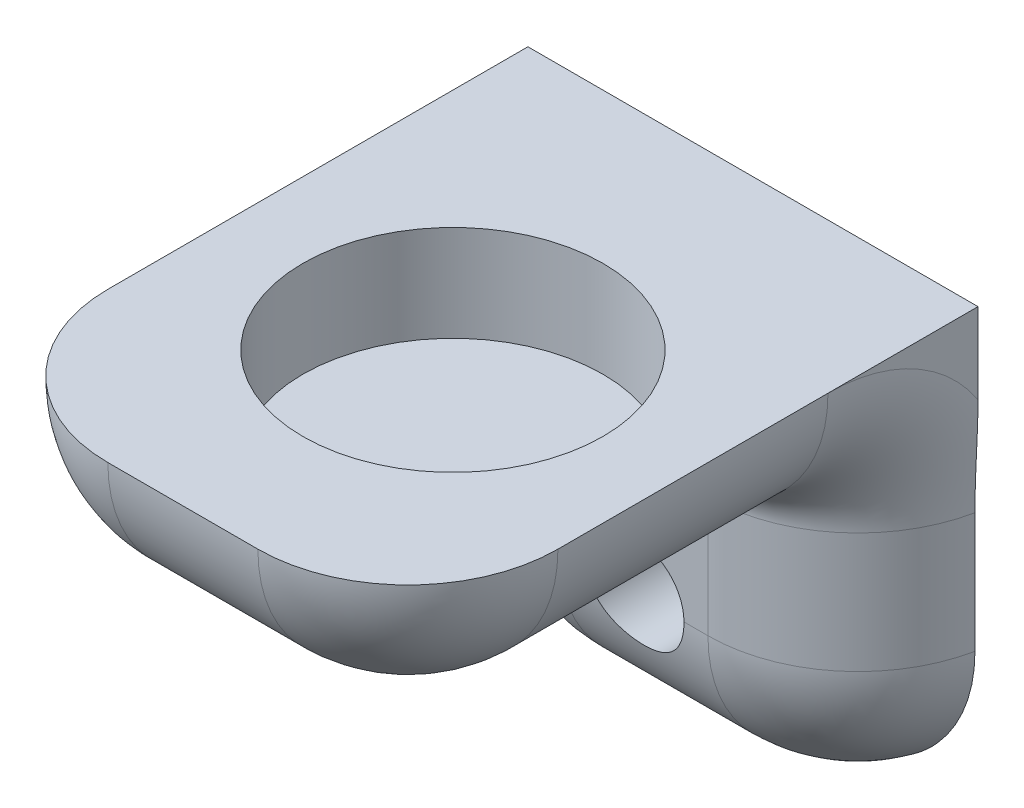
ISO-10303-21;
HEADER;
FILE_DESCRIPTION(('STEP AP214'),'2;1');
FILE_NAME('part.step','',(''),(''),'','','');
FILE_SCHEMA(('AUTOMOTIVE_DESIGN { 1 0 10303 214 1 1 1 1 }'));
ENDSEC;
DATA;
#1=APPLICATION_CONTEXT('core data for automotive mechanical design processes');
#2=APPLICATION_PROTOCOL_DEFINITION('international standard','automotive_design',2000,#1);
#3=PRODUCT_CONTEXT('',#1,'mechanical');
#4=PRODUCT('Part','Part','',(#3));
#5=PRODUCT_RELATED_PRODUCT_CATEGORY('part','',(#4));
#6=PRODUCT_DEFINITION_FORMATION('','',#4);
#7=PRODUCT_DEFINITION_CONTEXT('part definition',#1,'design');
#8=PRODUCT_DEFINITION('design','',#6,#7);
#9=PRODUCT_DEFINITION_SHAPE('','',#8);
#10=(LENGTH_UNIT() NAMED_UNIT(*) SI_UNIT(.MILLI.,.METRE.));
#11=(NAMED_UNIT(*) PLANE_ANGLE_UNIT() SI_UNIT($,.RADIAN.));
#12=(NAMED_UNIT(*) SI_UNIT($,.STERADIAN.) SOLID_ANGLE_UNIT());
#13=UNCERTAINTY_MEASURE_WITH_UNIT(LENGTH_MEASURE(1.E-05),#10,'distance_accuracy_value','');
#14=(GEOMETRIC_REPRESENTATION_CONTEXT(3) GLOBAL_UNCERTAINTY_ASSIGNED_CONTEXT((#13)) GLOBAL_UNIT_ASSIGNED_CONTEXT((#10,
#11,#12)) REPRESENTATION_CONTEXT('',''));
#15=CARTESIAN_POINT('',(0.,0.,0.));
#16=DIRECTION('',(0.,0.,1.));
#17=DIRECTION('',(1.,0.,0.));
#18=AXIS2_PLACEMENT_3D('',#15,#16,#17);
#19=CARTESIAN_POINT('',(0.,15.,0.));
#20=DIRECTION('',(0.,0.,-1.));
#21=DIRECTION('',(-1.,0.,0.));
#22=AXIS2_PLACEMENT_3D('',#19,#20,#21);
#23=PLANE('',#22);
#24=DIRECTION('',(0.,-1.,0.));
#25=VECTOR('',#24,1.);
#26=CARTESIAN_POINT('',(5.,15.,0.));
#27=LINE('',#26,#25);
#28=CARTESIAN_POINT('',(5.,9.,0.));
#29=VERTEX_POINT('',#28);
#30=CARTESIAN_POINT('',(5.,5.,0.));
#31=VERTEX_POINT('',#30);
#32=EDGE_CURVE('E170',#29,#31,#27,.T.);
#33=ORIENTED_EDGE('',*,*,#32,.T.);
#34=DIRECTION('',(1.,0.,0.));
#35=VECTOR('',#34,1.);
#36=CARTESIAN_POINT('',(10.,5.,0.));
#37=LINE('',#36,#35);
#38=CARTESIAN_POINT('',(6.00102051443364,5.,0.));
#39=VERTEX_POINT('',#38);
#40=EDGE_CURVE('E49',#31,#39,#37,.T.);
#41=ORIENTED_EDGE('',*,*,#40,.T.);
#42=CARTESIAN_POINT('',(7.60102051443364,5.,0.));
#43=DIRECTION('',(0.,0.,1.));
#44=DIRECTION('',(1.,0.,0.));
#45=AXIS2_PLACEMENT_3D('',#42,#43,#44);
#46=CIRCLE('',#45,1.6);
#47=CARTESIAN_POINT('',(9.20102051443365,5.,0.));
#48=VERTEX_POINT('',#47);
#49=EDGE_CURVE('E359',#48,#39,#46,.T.);
#50=ORIENTED_EDGE('',*,*,#49,.F.);
#51=DIRECTION('',(1.,0.,0.));
#52=VECTOR('',#51,1.);
#53=CARTESIAN_POINT('',(10.,5.,0.));
#54=LINE('',#53,#52);
#55=CARTESIAN_POINT('',(10.,5.,0.));
#56=VERTEX_POINT('',#55);
#57=EDGE_CURVE('E320',#48,#56,#54,.T.);
#58=ORIENTED_EDGE('',*,*,#57,.T.);
#59=DIRECTION('',(0.,-1.,0.));
#60=VECTOR('',#59,1.);
#61=CARTESIAN_POINT('',(10.,15.,0.));
#62=LINE('',#61,#60);
#63=CARTESIAN_POINT('',(10.,9.,0.));
#64=VERTEX_POINT('',#63);
#65=EDGE_CURVE('E168',#56,#64,#62,.F.);
#66=ORIENTED_EDGE('',*,*,#65,.T.);
#67=DIRECTION('',(1.,0.,0.));
#68=VECTOR('',#67,1.);
#69=CARTESIAN_POINT('',(0.,9.,0.));
#70=LINE('',#69,#68);
#71=EDGE_CURVE('E165',#64,#29,#70,.F.);
#72=ORIENTED_EDGE('',*,*,#71,.T.);
#73=EDGE_LOOP('',(#33,#41,#50,#58,#66,#72));
#74=FACE_BOUND('',#73,.T.);
#75=ADVANCED_FACE('F40',(#74),#23,.F.);
#76=CARTESIAN_POINT('',(0.,15.,0.));
#77=DIRECTION('',(1.,0.,0.));
#78=DIRECTION('',(0.,0.,-1.));
#79=AXIS2_PLACEMENT_3D('',#76,#77,#78);
#80=PLANE('',#79);
#81=DIRECTION('',(0.,-1.,0.));
#82=VECTOR('',#81,1.);
#83=CARTESIAN_POINT('',(0.,15.,-4.));
#84=LINE('',#83,#82);
#85=CARTESIAN_POINT('',(0.,15.,-4.));
#86=VERTEX_POINT('',#85);
#87=CARTESIAN_POINT('',(0.,12.3166247903554,-4.));
#88=VERTEX_POINT('',#87);
#89=EDGE_CURVE('E154',#86,#88,#84,.T.);
#90=ORIENTED_EDGE('',*,*,#89,.T.);
#91=CARTESIAN_POINT('',(0.,9.,1.));
#92=DIRECTION('',(1.,0.,0.));
#93=DIRECTION('',(0.,0.,-1.));
#94=AXIS2_PLACEMENT_3D('',#91,#92,#93);
#95=CIRCLE('',#94,6.);
#96=CARTESIAN_POINT('',(0.,15.,1.));
#97=VERTEX_POINT('',#96);
#98=EDGE_CURVE('E280',#88,#97,#95,.T.);
#99=ORIENTED_EDGE('',*,*,#98,.T.);
#100=DIRECTION('',(0.,0.,1.));
#101=VECTOR('',#100,1.);
#102=CARTESIAN_POINT('',(0.,15.,0.));
#103=LINE('',#102,#101);
#104=EDGE_CURVE('E145',#86,#97,#103,.T.);
#105=ORIENTED_EDGE('',*,*,#104,.F.);
#106=EDGE_LOOP('',(#90,#99,#105));
#107=FACE_BOUND('',#106,.T.);
#108=ADVANCED_FACE('F236',(#107),#80,.F.);
#109=CARTESIAN_POINT('',(15.,15.,0.));
#110=DIRECTION('',(-1.,0.,0.));
#111=DIRECTION('',(0.,0.,1.));
#112=AXIS2_PLACEMENT_3D('',#109,#110,#111);
#113=PLANE('',#112);
#114=DIRECTION('',(0.,0.,-1.));
#115=VECTOR('',#114,1.);
#116=CARTESIAN_POINT('',(15.,15.,0.));
#117=LINE('',#116,#115);
#118=CARTESIAN_POINT('',(15.,15.,1.));
#119=VERTEX_POINT('',#118);
#120=CARTESIAN_POINT('',(15.,15.,-4.));
#121=VERTEX_POINT('',#120);
#122=EDGE_CURVE('E134',#119,#121,#117,.T.);
#123=ORIENTED_EDGE('',*,*,#122,.F.);
#124=CARTESIAN_POINT('',(15.,9.,1.));
#125=DIRECTION('',(-1.,0.,0.));
#126=DIRECTION('',(0.,0.,1.));
#127=AXIS2_PLACEMENT_3D('',#124,#125,#126);
#128=CIRCLE('',#127,6.);
#129=CARTESIAN_POINT('',(15.,12.3166247903554,-4.));
#130=VERTEX_POINT('',#129);
#131=EDGE_CURVE('E150',#119,#130,#128,.T.);
#132=ORIENTED_EDGE('',*,*,#131,.T.);
#133=DIRECTION('',(0.,-1.,0.));
#134=VECTOR('',#133,1.);
#135=CARTESIAN_POINT('',(15.,15.,-4.));
#136=LINE('',#135,#134);
#137=EDGE_CURVE('E148',#121,#130,#136,.T.);
#138=ORIENTED_EDGE('',*,*,#137,.F.);
#139=EDGE_LOOP('',(#123,#132,#138));
#140=FACE_BOUND('',#139,.T.);
#141=ADVANCED_FACE('F149',(#140),#113,.F.);
#142=CARTESIAN_POINT('',(0.,15.,-4.));
#143=DIRECTION('',(0.,0.,1.));
#144=DIRECTION('',(1.,0.,0.));
#145=AXIS2_PLACEMENT_3D('',#142,#143,#144);
#146=PLANE('',#145);
#147=CARTESIAN_POINT('',(7.60102051443364,5.,-4.));
#148=DIRECTION('',(0.,0.,1.));
#149=DIRECTION('',(1.,0.,0.));
#150=AXIS2_PLACEMENT_3D('',#147,#148,#149);
#151=CIRCLE('',#150,1.6);
#152=CARTESIAN_POINT('',(9.20102051443365,5.,-4.));
#153=VERTEX_POINT('',#152);
#154=EDGE_CURVE('E355',#153,#153,#151,.T.);
#155=ORIENTED_EDGE('',*,*,#154,.T.);
#156=EDGE_LOOP('',(#155));
#157=FACE_BOUND('',#156,.T.);
#158=DIRECTION('',(-1.,0.,0.));
#159=VECTOR('',#158,1.);
#160=CARTESIAN_POINT('',(7.5,0.101020514433644,-4.));
#161=LINE('',#160,#159);
#162=CARTESIAN_POINT('',(10.,0.101020514433644,-4.));
#163=VERTEX_POINT('',#162);
#164=CARTESIAN_POINT('',(5.,0.101020514433644,-4.));
#165=VERTEX_POINT('',#164);
#166=EDGE_CURVE('E291',#163,#165,#161,.T.);
#167=ORIENTED_EDGE('',*,*,#166,.T.);
#168=CARTESIAN_POINT('',(5.,5.,-4.));
#169=DIRECTION('',(0.,0.,1.));
#170=DIRECTION('',(1.,0.,0.));
#171=AXIS2_PLACEMENT_3D('',#168,#169,#170);
#172=CIRCLE('',#171,4.89897948556636);
#173=CARTESIAN_POINT('',(0.101020514433644,5.,-4.));
#174=VERTEX_POINT('',#173);
#175=EDGE_CURVE('E313',#165,#174,#172,.F.);
#176=ORIENTED_EDGE('',*,*,#175,.T.);
#177=DIRECTION('',(0.,-1.,0.));
#178=VECTOR('',#177,1.);
#179=CARTESIAN_POINT('',(0.101020514433644,15.,-4.));
#180=LINE('',#179,#178);
#181=CARTESIAN_POINT('',(0.101020514433644,9.,-4.));
#182=VERTEX_POINT('',#181);
#183=EDGE_CURVE('E201',#174,#182,#180,.F.);
#184=ORIENTED_EDGE('',*,*,#183,.T.);
#185=CARTESIAN_POINT('',(0.,12.3166247903554,-4.));
#186=CARTESIAN_POINT('',(-2.04095656584387E-05,12.0663108047687,-4.));
#187=CARTESIAN_POINT('',(0.00575231969093224,11.8161673244834,-4.));
#188=CARTESIAN_POINT('',(0.0231662916980991,11.3159421674856,-4.));
#189=CARTESIAN_POINT('',(0.0348103486002614,11.0658605779996,-4.));
#190=CARTESIAN_POINT('',(0.0582269193873895,10.5659617174074,-4.));
#191=CARTESIAN_POINT('',(0.069999298149321,10.3161444245785,-4.));
#192=CARTESIAN_POINT('',(0.0841133302114016,9.94133773124193,-4.));
#193=CARTESIAN_POINT('',(0.0882266165718284,9.81642257307664,-4.));
#194=CARTESIAN_POINT('',(0.0948669161383671,9.5665509912262,-4.));
#195=CARTESIAN_POINT('',(0.0973939423629116,9.44159456788813,-4.));
#196=CARTESIAN_POINT('',(0.10121254881285,9.14201023592978,-4.));
#197=CARTESIAN_POINT('',(0.101614550439973,8.96736960984983,-4.));
#198=CARTESIAN_POINT('',(0.0986775646880203,8.61812398898265,-4.));
#199=CARTESIAN_POINT('',(0.0953386064589485,8.44351899392838,-4.));
#200=CARTESIAN_POINT('',(0.0855964647221263,8.09428254763972,-4.));
#201=CARTESIAN_POINT('',(0.0791912163260501,7.91965115796903,-4.));
#202=CARTESIAN_POINT('',(0.0646193707126576,7.57045322866892,-4.));
#203=CARTESIAN_POINT('',(0.0564526310243207,7.39588669542984,-4.));
#204=CARTESIAN_POINT('',(0.0400619796044627,7.0464257473184,-4.));
#205=CARTESIAN_POINT('',(0.0318379890587366,6.87153133545556,-4.));
#206=CARTESIAN_POINT('',(0.0172772992910221,6.52169135884608,-4.));
#207=CARTESIAN_POINT('',(0.010940251788213,6.34674580951243,-4.));
#208=CARTESIAN_POINT('',(0.00212916032526089,5.99684610524887,-4.));
#209=CARTESIAN_POINT('',(-0.000347329343182006,5.8218920260422,-4.));
#210=CARTESIAN_POINT('',(0.000429292772381009,5.47188918090066,-4.));
#211=CARTESIAN_POINT('',(0.00368625853783284,5.29684043040578,-4.));
#212=CARTESIAN_POINT('',(0.0107506506808872,5.12187447574038,-4.));
#213=B_SPLINE_CURVE_WITH_KNOTS('',3,(#185,#186,#187,#188,#189,#190,#191,#192,#193,#194,#195,
#196,#197,#198,#199,#200,#201,#202,#203,#204,#205,#206,#207,#208,#209,#210,#211,#212),
.UNSPECIFIED.,.F.,.F.,(4,2,2,2,2,2,2,2,2,2,2,2,2,4),(0.,0.750649294851886,1.50165872149874,
2.2519418379518,2.62688022043154,3.00181552575274,3.52569547952752,4.04957135119584,
4.57380050650158,5.09807207784908,5.62333315725208,6.14849722688053,6.67332846356113,
7.19851262219279),.UNSPECIFIED.);
#214=EDGE_CURVE('E194',#182,#88,#213,.F.);
#215=ORIENTED_EDGE('',*,*,#214,.T.);
#216=ORIENTED_EDGE('',*,*,#89,.F.);
#217=DIRECTION('',(-1.,0.,0.));
#218=VECTOR('',#217,1.);
#219=CARTESIAN_POINT('',(0.,15.,-4.));
#220=LINE('',#219,#218);
#221=EDGE_CURVE('E139',#121,#86,#220,.T.);
#222=ORIENTED_EDGE('',*,*,#221,.F.);
#223=ORIENTED_EDGE('',*,*,#137,.T.);
#224=CARTESIAN_POINT('',(15.,12.3166247903554,-4.));
#225=CARTESIAN_POINT('',(15.0000204095657,12.0663108047687,-4.));
#226=CARTESIAN_POINT('',(14.9942476803091,11.8161673244834,-4.));
#227=CARTESIAN_POINT('',(14.9768337083019,11.3159421674856,-4.));
#228=CARTESIAN_POINT('',(14.9651896513997,11.0658605779996,-4.));
#229=CARTESIAN_POINT('',(14.9417730806126,10.5659617174074,-4.));
#230=CARTESIAN_POINT('',(14.9300007018507,10.3161444245785,-4.));
#231=CARTESIAN_POINT('',(14.9158866697886,9.94133773124193,-4.));
#232=CARTESIAN_POINT('',(14.9117733834282,9.81642257307664,-4.));
#233=CARTESIAN_POINT('',(14.9051330838616,9.5665509912262,-4.));
#234=CARTESIAN_POINT('',(14.9026060576371,9.44159456788813,-4.));
#235=CARTESIAN_POINT('',(14.8987874511871,9.14201023592978,-4.));
#236=CARTESIAN_POINT('',(14.89838544956,8.96736960984983,-4.));
#237=CARTESIAN_POINT('',(14.901322435312,8.61812398898265,-4.));
#238=CARTESIAN_POINT('',(14.904661393541,8.44351899392838,-4.));
#239=CARTESIAN_POINT('',(14.9144035352779,8.09428254763971,-4.));
#240=CARTESIAN_POINT('',(14.9208087836739,7.91965115796903,-4.));
#241=CARTESIAN_POINT('',(14.9353806292873,7.57045322866892,-4.));
#242=CARTESIAN_POINT('',(14.9435473689757,7.39588669542984,-4.));
#243=CARTESIAN_POINT('',(14.9599380203955,7.04642574731839,-4.));
#244=CARTESIAN_POINT('',(14.9681620109413,6.87153133545556,-4.));
#245=CARTESIAN_POINT('',(14.982722700709,6.52169135884608,-4.));
#246=CARTESIAN_POINT('',(14.9890597482118,6.34674580951243,-4.));
#247=CARTESIAN_POINT('',(14.9978708396747,5.99684610524887,-4.));
#248=CARTESIAN_POINT('',(15.0003473293432,5.8218920260422,-4.));
#249=CARTESIAN_POINT('',(14.9995707072276,5.47188918090066,-4.));
#250=CARTESIAN_POINT('',(14.9963137414622,5.29684043040578,-4.));
#251=CARTESIAN_POINT('',(14.9892493493191,5.12187447574038,-4.));
#252=B_SPLINE_CURVE_WITH_KNOTS('',3,(#224,#225,#226,#227,#228,#229,#230,#231,#232,#233,#234,
#235,#236,#237,#238,#239,#240,#241,#242,#243,#244,#245,#246,#247,#248,#249,#250,#251),
.UNSPECIFIED.,.F.,.F.,(4,2,2,2,2,2,2,2,2,2,2,2,2,4),(0.,0.750649294851886,1.50165872149874,
2.2519418379518,2.62688022043154,3.00181552575274,3.52569547952752,4.04957135119584,
4.57380050650158,5.09807207784909,5.62333315725209,6.14849722688053,6.67332846356113,
7.19851262219279),.UNSPECIFIED.);
#253=CARTESIAN_POINT('',(14.8989794855664,9.,-4.));
#254=VERTEX_POINT('',#253);
#255=EDGE_CURVE('E172',#130,#254,#252,.T.);
#256=ORIENTED_EDGE('',*,*,#255,.T.);
#257=DIRECTION('',(0.,-1.,0.));
#258=VECTOR('',#257,1.);
#259=CARTESIAN_POINT('',(14.8989794855664,15.,-4.));
#260=LINE('',#259,#258);
#261=CARTESIAN_POINT('',(14.8989794855664,5.,-4.));
#262=VERTEX_POINT('',#261);
#263=EDGE_CURVE('E180',#254,#262,#260,.T.);
#264=ORIENTED_EDGE('',*,*,#263,.T.);
#265=CARTESIAN_POINT('',(10.,5.,-4.));
#266=DIRECTION('',(0.,0.,1.));
#267=DIRECTION('',(1.,0.,0.));
#268=AXIS2_PLACEMENT_3D('',#265,#266,#267);
#269=CIRCLE('',#268,4.89897948556636);
#270=EDGE_CURVE('E311',#262,#163,#269,.F.);
#271=ORIENTED_EDGE('',*,*,#270,.T.);
#272=EDGE_LOOP('',(#167,#176,#184,#215,#216,#222,#223,#256,#264,#271));
#273=FACE_BOUND('',#272,.T.);
#274=ADVANCED_FACE('F156',(#157,#273),#146,.F.);
#275=CARTESIAN_POINT('',(0.,15.,0.));
#276=DIRECTION('',(0.,-1.,0.));
#277=DIRECTION('',(0.,0.,-1.));
#278=AXIS2_PLACEMENT_3D('',#275,#276,#277);
#279=PLANE('',#278);
#280=CARTESIAN_POINT('',(7.5,15.,6.));
#281=DIRECTION('',(0.,1.,0.));
#282=DIRECTION('',(0.,0.,1.));
#283=AXIS2_PLACEMENT_3D('',#280,#281,#282);
#284=CIRCLE('',#283,5.);
#285=CARTESIAN_POINT('',(7.5,15.,11.));
#286=VERTEX_POINT('',#285);
#287=EDGE_CURVE('E353',#286,#286,#284,.T.);
#288=ORIENTED_EDGE('',*,*,#287,.F.);
#289=EDGE_LOOP('',(#288));
#290=FACE_BOUND('',#289,.T.);
#291=CARTESIAN_POINT('',(0.,15.,10.));
#292=VERTEX_POINT('',#291);
#293=EDGE_CURVE('E268',#97,#292,#103,.T.);
#294=ORIENTED_EDGE('',*,*,#293,.T.);
#295=CARTESIAN_POINT('',(5.,15.,10.));
#296=DIRECTION('',(0.,-1.,0.));
#297=DIRECTION('',(0.,0.,-1.));
#298=AXIS2_PLACEMENT_3D('',#295,#296,#297);
#299=CIRCLE('',#298,5.);
#300=CARTESIAN_POINT('',(5.,15.,15.));
#301=VERTEX_POINT('',#300);
#302=EDGE_CURVE('E289',#292,#301,#299,.F.);
#303=ORIENTED_EDGE('',*,*,#302,.T.);
#304=DIRECTION('',(-1.,0.,0.));
#305=VECTOR('',#304,1.);
#306=CARTESIAN_POINT('',(0.,15.,15.));
#307=LINE('',#306,#305);
#308=CARTESIAN_POINT('',(10.,15.,15.));
#309=VERTEX_POINT('',#308);
#310=EDGE_CURVE('E309',#309,#301,#307,.T.);
#311=ORIENTED_EDGE('',*,*,#310,.F.);
#312=CARTESIAN_POINT('',(10.,15.,10.));
#313=DIRECTION('',(0.,-1.,0.));
#314=DIRECTION('',(0.,0.,-1.));
#315=AXIS2_PLACEMENT_3D('',#312,#313,#314);
#316=CIRCLE('',#315,5.);
#317=CARTESIAN_POINT('',(15.,15.,10.));
#318=VERTEX_POINT('',#317);
#319=EDGE_CURVE('E287',#309,#318,#316,.F.);
#320=ORIENTED_EDGE('',*,*,#319,.T.);
#321=EDGE_CURVE('E142',#318,#119,#117,.T.);
#322=ORIENTED_EDGE('',*,*,#321,.T.);
#323=ORIENTED_EDGE('',*,*,#122,.T.);
#324=ORIENTED_EDGE('',*,*,#221,.T.);
#325=ORIENTED_EDGE('',*,*,#104,.T.);
#326=EDGE_LOOP('',(#294,#303,#311,#320,#322,#323,#324,#325));
#327=FACE_BOUND('',#326,.T.);
#328=ADVANCED_FACE('F136',(#290,#327),#279,.F.);
#329=CARTESIAN_POINT('',(0.,10.,15.));
#330=DIRECTION('',(0.,1.,0.));
#331=DIRECTION('',(0.,0.,1.));
#332=AXIS2_PLACEMENT_3D('',#329,#330,#331);
#333=PLANE('',#332);
#334=DIRECTION('',(1.,0.,0.));
#335=VECTOR('',#334,1.);
#336=CARTESIAN_POINT('',(0.,10.,10.));
#337=LINE('',#336,#335);
#338=CARTESIAN_POINT('',(10.,10.,10.));
#339=VERTEX_POINT('',#338);
#340=CARTESIAN_POINT('',(5.,10.,10.));
#341=VERTEX_POINT('',#340);
#342=EDGE_CURVE('E278',#339,#341,#337,.F.);
#343=ORIENTED_EDGE('',*,*,#342,.T.);
#344=DIRECTION('',(0.,0.,-1.));
#345=VECTOR('',#344,1.);
#346=CARTESIAN_POINT('',(5.,10.,15.));
#347=LINE('',#346,#345);
#348=CARTESIAN_POINT('',(5.,10.,1.));
#349=VERTEX_POINT('',#348);
#350=EDGE_CURVE('E267',#341,#349,#347,.T.);
#351=ORIENTED_EDGE('',*,*,#350,.T.);
#352=DIRECTION('',(1.,0.,0.));
#353=VECTOR('',#352,1.);
#354=CARTESIAN_POINT('',(15.,10.,1.));
#355=LINE('',#354,#353);
#356=CARTESIAN_POINT('',(10.,10.,1.));
#357=VERTEX_POINT('',#356);
#358=EDGE_CURVE('E153',#349,#357,#355,.T.);
#359=ORIENTED_EDGE('',*,*,#358,.T.);
#360=DIRECTION('',(0.,0.,-1.));
#361=VECTOR('',#360,1.);
#362=CARTESIAN_POINT('',(10.,10.,15.));
#363=LINE('',#362,#361);
#364=EDGE_CURVE('E284',#357,#339,#363,.F.);
#365=ORIENTED_EDGE('',*,*,#364,.T.);
#366=EDGE_LOOP('',(#343,#351,#359,#365));
#367=FACE_BOUND('',#366,.T.);
#368=ADVANCED_FACE('F245',(#367),#333,.F.);
#369=CARTESIAN_POINT('',(0.,9.,1.));
#370=DIRECTION('',(-1.,0.,0.));
#371=DIRECTION('',(0.,0.,1.));
#372=AXIS2_PLACEMENT_3D('',#369,#370,#371);
#373=CYLINDRICAL_SURFACE('',#372,1.);
#374=ORIENTED_EDGE('',*,*,#358,.F.);
#375=CARTESIAN_POINT('',(5.,9.,1.));
#376=DIRECTION('',(1.,0.,0.));
#377=DIRECTION('',(0.,0.,-1.));
#378=AXIS2_PLACEMENT_3D('',#375,#376,#377);
#379=CIRCLE('',#378,1.);
#380=EDGE_CURVE('E258',#349,#29,#379,.F.);
#381=ORIENTED_EDGE('',*,*,#380,.T.);
#382=ORIENTED_EDGE('',*,*,#71,.F.);
#383=CARTESIAN_POINT('',(10.,9.,1.));
#384=DIRECTION('',(-1.,0.,0.));
#385=DIRECTION('',(0.,0.,1.));
#386=AXIS2_PLACEMENT_3D('',#383,#384,#385);
#387=CIRCLE('',#386,1.);
#388=EDGE_CURVE('E260',#64,#357,#387,.F.);
#389=ORIENTED_EDGE('',*,*,#388,.T.);
#390=EDGE_LOOP('',(#374,#381,#382,#389));
#391=FACE_BOUND('',#390,.T.);
#392=ADVANCED_FACE('F243',(#391),#373,.F.);
#393=CARTESIAN_POINT('',(10.,15.,-5.));
#394=DIRECTION('',(0.,-1.,0.));
#395=DIRECTION('',(0.,0.,-1.));
#396=AXIS2_PLACEMENT_3D('',#393,#394,#395);
#397=CYLINDRICAL_SURFACE('',#396,5.);
#398=ORIENTED_EDGE('',*,*,#65,.F.);
#399=CARTESIAN_POINT('',(10.,5.,-5.));
#400=DIRECTION('',(0.,-1.,0.));
#401=DIRECTION('',(0.,0.,-1.));
#402=AXIS2_PLACEMENT_3D('',#399,#400,#401);
#403=CIRCLE('',#402,5.);
#404=EDGE_CURVE('E318',#56,#262,#403,.F.);
#405=ORIENTED_EDGE('',*,*,#404,.T.);
#406=ORIENTED_EDGE('',*,*,#263,.F.);
#407=CARTESIAN_POINT('',(10.,9.,-5.));
#408=DIRECTION('',(0.,1.,0.));
#409=DIRECTION('',(0.,0.,1.));
#410=AXIS2_PLACEMENT_3D('',#407,#408,#409);
#411=CIRCLE('',#410,5.);
#412=EDGE_CURVE('E306',#64,#254,#411,.T.);
#413=ORIENTED_EDGE('',*,*,#412,.F.);
#414=EDGE_LOOP('',(#398,#405,#406,#413));
#415=FACE_BOUND('',#414,.T.);
#416=ADVANCED_FACE('F232',(#415),#397,.T.);
#417=CARTESIAN_POINT('',(10.,9.,1.));
#418=DIRECTION('',(-1.,0.,0.));
#419=DIRECTION('',(0.,0.,1.));
#420=AXIS2_PLACEMENT_3D('',#417,#418,#419);
#421=TOROIDAL_SURFACE('',#420,6.,5.);
#422=ORIENTED_EDGE('',*,*,#255,.F.);
#423=ORIENTED_EDGE('',*,*,#131,.F.);
#424=CARTESIAN_POINT('',(10.,15.,1.));
#425=DIRECTION('',(0.,0.,1.));
#426=DIRECTION('',(1.,0.,0.));
#427=AXIS2_PLACEMENT_3D('',#424,#425,#426);
#428=CIRCLE('',#427,5.);
#429=EDGE_CURVE('E304',#357,#119,#428,.T.);
#430=ORIENTED_EDGE('',*,*,#429,.F.);
#431=ORIENTED_EDGE('',*,*,#388,.F.);
#432=ORIENTED_EDGE('',*,*,#412,.T.);
#433=EDGE_LOOP('',(#422,#423,#430,#431,#432));
#434=FACE_BOUND('',#433,.T.);
#435=ADVANCED_FACE('F182',(#434),#421,.T.);
#436=CARTESIAN_POINT('',(10.,15.,0.));
#437=DIRECTION('',(0.,0.,-1.));
#438=DIRECTION('',(-1.,0.,0.));
#439=AXIS2_PLACEMENT_3D('',#436,#437,#438);
#440=CYLINDRICAL_SURFACE('',#439,5.);
#441=ORIENTED_EDGE('',*,*,#429,.T.);
#442=ORIENTED_EDGE('',*,*,#321,.F.);
#443=CARTESIAN_POINT('',(10.,15.,10.));
#444=DIRECTION('',(0.,0.,1.));
#445=DIRECTION('',(1.,0.,0.));
#446=AXIS2_PLACEMENT_3D('',#443,#444,#445);
#447=CIRCLE('',#446,5.);
#448=EDGE_CURVE('E301',#339,#318,#447,.T.);
#449=ORIENTED_EDGE('',*,*,#448,.F.);
#450=ORIENTED_EDGE('',*,*,#364,.F.);
#451=EDGE_LOOP('',(#441,#442,#449,#450));
#452=FACE_BOUND('',#451,.T.);
#453=ADVANCED_FACE('F225',(#452),#440,.T.);
#454=CARTESIAN_POINT('',(10.,15.,10.));
#455=DIRECTION('',(1.,0.,0.));
#456=DIRECTION('',(0.,0.,-1.));
#457=AXIS2_PLACEMENT_3D('',#454,#455,#456);
#458=SPHERICAL_SURFACE('',#457,5.);
#459=ORIENTED_EDGE('',*,*,#448,.T.);
#460=ORIENTED_EDGE('',*,*,#319,.F.);
#461=CARTESIAN_POINT('',(10.,15.,10.));
#462=DIRECTION('',(1.,0.,0.));
#463=DIRECTION('',(0.,0.,-1.));
#464=AXIS2_PLACEMENT_3D('',#461,#462,#463);
#465=CIRCLE('',#464,5.);
#466=EDGE_CURVE('E298',#339,#309,#465,.F.);
#467=ORIENTED_EDGE('',*,*,#466,.F.);
#468=EDGE_LOOP('',(#459,#460,#467));
#469=FACE_BOUND('',#468,.T.);
#470=ADVANCED_FACE('F222',(#469),#458,.T.);
#471=CARTESIAN_POINT('',(0.,15.,10.));
#472=DIRECTION('',(-1.,0.,0.));
#473=DIRECTION('',(0.,0.,1.));
#474=AXIS2_PLACEMENT_3D('',#471,#472,#473);
#475=CYLINDRICAL_SURFACE('',#474,5.);
#476=ORIENTED_EDGE('',*,*,#466,.T.);
#477=ORIENTED_EDGE('',*,*,#310,.T.);
#478=CARTESIAN_POINT('',(5.,15.,10.));
#479=DIRECTION('',(-1.,0.,0.));
#480=DIRECTION('',(0.,0.,1.));
#481=AXIS2_PLACEMENT_3D('',#478,#479,#480);
#482=CIRCLE('',#481,5.);
#483=EDGE_CURVE('E295',#341,#301,#482,.T.);
#484=ORIENTED_EDGE('',*,*,#483,.F.);
#485=ORIENTED_EDGE('',*,*,#342,.F.);
#486=EDGE_LOOP('',(#476,#477,#484,#485));
#487=FACE_BOUND('',#486,.T.);
#488=ADVANCED_FACE('F218',(#487),#475,.T.);
#489=CARTESIAN_POINT('',(5.,15.,10.));
#490=DIRECTION('',(0.,0.,1.));
#491=DIRECTION('',(1.,0.,0.));
#492=AXIS2_PLACEMENT_3D('',#489,#490,#491);
#493=SPHERICAL_SURFACE('',#492,5.);
#494=ORIENTED_EDGE('',*,*,#483,.T.);
#495=ORIENTED_EDGE('',*,*,#302,.F.);
#496=CARTESIAN_POINT('',(5.,15.,10.));
#497=DIRECTION('',(0.,0.,1.));
#498=DIRECTION('',(1.,0.,0.));
#499=AXIS2_PLACEMENT_3D('',#496,#497,#498);
#500=CIRCLE('',#499,5.);
#501=EDGE_CURVE('E270',#341,#292,#500,.F.);
#502=ORIENTED_EDGE('',*,*,#501,.F.);
#503=EDGE_LOOP('',(#494,#495,#502));
#504=FACE_BOUND('',#503,.T.);
#505=ADVANCED_FACE('F214',(#504),#493,.T.);
#506=CARTESIAN_POINT('',(5.,15.,15.));
#507=DIRECTION('',(0.,0.,-1.));
#508=DIRECTION('',(-1.,0.,0.));
#509=AXIS2_PLACEMENT_3D('',#506,#507,#508);
#510=CYLINDRICAL_SURFACE('',#509,5.);
#511=ORIENTED_EDGE('',*,*,#501,.T.);
#512=ORIENTED_EDGE('',*,*,#293,.F.);
#513=CARTESIAN_POINT('',(5.,15.,1.));
#514=DIRECTION('',(0.,0.,-1.));
#515=DIRECTION('',(-1.,0.,0.));
#516=AXIS2_PLACEMENT_3D('',#513,#514,#515);
#517=CIRCLE('',#516,5.);
#518=EDGE_CURVE('E265',#349,#97,#517,.T.);
#519=ORIENTED_EDGE('',*,*,#518,.F.);
#520=ORIENTED_EDGE('',*,*,#350,.F.);
#521=EDGE_LOOP('',(#511,#512,#519,#520));
#522=FACE_BOUND('',#521,.T.);
#523=ADVANCED_FACE('F209',(#522),#510,.T.);
#524=CARTESIAN_POINT('',(5.,9.,1.));
#525=DIRECTION('',(1.,0.,0.));
#526=DIRECTION('',(0.,0.,-1.));
#527=AXIS2_PLACEMENT_3D('',#524,#525,#526);
#528=TOROIDAL_SURFACE('',#527,6.,5.);
#529=ORIENTED_EDGE('',*,*,#98,.F.);
#530=ORIENTED_EDGE('',*,*,#214,.F.);
#531=CARTESIAN_POINT('',(5.,9.,-5.));
#532=DIRECTION('',(0.,-1.,0.));
#533=DIRECTION('',(0.,0.,-1.));
#534=AXIS2_PLACEMENT_3D('',#531,#532,#533);
#535=CIRCLE('',#534,5.);
#536=EDGE_CURVE('E271',#29,#182,#535,.T.);
#537=ORIENTED_EDGE('',*,*,#536,.F.);
#538=ORIENTED_EDGE('',*,*,#380,.F.);
#539=ORIENTED_EDGE('',*,*,#518,.T.);
#540=EDGE_LOOP('',(#529,#530,#537,#538,#539));
#541=FACE_BOUND('',#540,.T.);
#542=ADVANCED_FACE('F203',(#541),#528,.T.);
#543=CARTESIAN_POINT('',(5.,15.,-5.));
#544=DIRECTION('',(0.,-1.,0.));
#545=DIRECTION('',(0.,0.,-1.));
#546=AXIS2_PLACEMENT_3D('',#543,#544,#545);
#547=CYLINDRICAL_SURFACE('',#546,5.);
#548=ORIENTED_EDGE('',*,*,#183,.F.);
#549=CARTESIAN_POINT('',(5.,5.,-5.));
#550=DIRECTION('',(0.,-1.,0.));
#551=DIRECTION('',(0.,0.,-1.));
#552=AXIS2_PLACEMENT_3D('',#549,#550,#551);
#553=CIRCLE('',#552,5.);
#554=EDGE_CURVE('E315',#174,#31,#553,.F.);
#555=ORIENTED_EDGE('',*,*,#554,.T.);
#556=ORIENTED_EDGE('',*,*,#32,.F.);
#557=ORIENTED_EDGE('',*,*,#536,.T.);
#558=EDGE_LOOP('',(#548,#555,#556,#557));
#559=FACE_BOUND('',#558,.T.);
#560=ADVANCED_FACE('F208',(#559),#547,.T.);
#561=CARTESIAN_POINT('',(7.5,11.8,6.));
#562=DIRECTION('',(0.,1.,0.));
#563=DIRECTION('',(0.,0.,1.));
#564=AXIS2_PLACEMENT_3D('',#561,#562,#563);
#565=CYLINDRICAL_SURFACE('',#564,5.);
#566=CARTESIAN_POINT('',(7.5,11.8,6.));
#567=DIRECTION('',(0.,1.,0.));
#568=DIRECTION('',(0.,0.,1.));
#569=AXIS2_PLACEMENT_3D('',#566,#567,#568);
#570=CIRCLE('',#569,5.);
#571=CARTESIAN_POINT('',(7.5,11.8,11.));
#572=VERTEX_POINT('',#571);
#573=EDGE_CURVE('E292',#572,#572,#570,.T.);
#574=ORIENTED_EDGE('',*,*,#573,.F.);
#575=EDGE_LOOP('',(#574));
#576=FACE_BOUND('',#575,.T.);
#577=ORIENTED_EDGE('',*,*,#287,.T.);
#578=EDGE_LOOP('',(#577));
#579=FACE_BOUND('',#578,.T.);
#580=ADVANCED_FACE('F339',(#576,#579),#565,.F.);
#581=CARTESIAN_POINT('',(7.5,11.8,6.));
#582=DIRECTION('',(0.,1.,0.));
#583=DIRECTION('',(0.,0.,1.));
#584=AXIS2_PLACEMENT_3D('',#581,#582,#583);
#585=PLANE('',#584);
#586=ORIENTED_EDGE('',*,*,#573,.T.);
#587=EDGE_LOOP('',(#586));
#588=FACE_BOUND('',#587,.T.);
#589=ADVANCED_FACE('F335',(#588),#585,.T.);
#590=CARTESIAN_POINT('',(7.60102051443364,5.,-4.));
#591=DIRECTION('',(0.,0.,1.));
#592=DIRECTION('',(1.,0.,0.));
#593=AXIS2_PLACEMENT_3D('',#590,#591,#592);
#594=CYLINDRICAL_SURFACE('',#593,1.6);
#595=ORIENTED_EDGE('',*,*,#154,.F.);
#596=EDGE_LOOP('',(#595));
#597=FACE_BOUND('',#596,.T.);
#598=ORIENTED_EDGE('',*,*,#49,.T.);
#599=CARTESIAN_POINT('',(6.00102051443364,5.,0.));
#600=CARTESIAN_POINT('',(6.00101959112884,4.95616956157197,3.12521509543308E-06));
#601=CARTESIAN_POINT('',(6.00282272015944,4.91236114214062,-0.000577020599907356));
#602=CARTESIAN_POINT('',(6.01000808763356,4.82507807367528,-0.00287048183184108));
#603=CARTESIAN_POINT('',(6.01538955008021,4.78160335434236,-0.00458355156261839));
#604=CARTESIAN_POINT('',(6.03680969267889,4.65238390693554,-0.0113568601728558));
#605=CARTESIAN_POINT('',(6.05812460157474,4.56753722619009,-0.018051662364575));
#606=CARTESIAN_POINT('',(6.11408222390366,4.40284891809321,-0.0350948002206598));
#607=CARTESIAN_POINT('',(6.14872069871624,4.32300570837422,-0.0454419738715196));
#608=CARTESIAN_POINT('',(6.23026373000405,4.17022575124948,-0.0687273276648206));
#609=CARTESIAN_POINT('',(6.27717388822424,4.0972921787003,-0.0816666904494026));
#610=CARTESIAN_POINT('',(6.38350337473285,3.95810592946166,-0.10922896920052));
#611=CARTESIAN_POINT('',(6.44324469790539,3.8921068672049,-0.123889700261182));
#612=CARTESIAN_POINT('',(6.57286013230051,3.77086875631018,-0.15302863442413));
#613=CARTESIAN_POINT('',(6.64273673768816,3.71563236409294,-0.167506791641274));
#614=CARTESIAN_POINT('',(6.79287506423452,3.61608485094472,-0.195052201108612));
#615=CARTESIAN_POINT('',(6.87336037631454,3.57209679427876,-0.208072721022972));
#616=CARTESIAN_POINT('',(7.04106673210781,3.49838952666433,-0.230653848389449));
#617=CARTESIAN_POINT('',(7.1282855949413,3.46866571809445,-0.24021557042878));
#618=CARTESIAN_POINT('',(7.30410220440279,3.42526887829417,-0.254398698221669));
#619=CARTESIAN_POINT('',(7.39257074156866,3.41112132839684,-0.259165750644954));
#620=CARTESIAN_POINT('',(7.57074621399303,3.3977956549364,-0.263651694484549));
#621=CARTESIAN_POINT('',(7.66045282156749,3.39861364353988,-0.263371897000737));
#622=CARTESIAN_POINT('',(7.83458660187773,3.41482623745029,-0.257923793427585));
#623=CARTESIAN_POINT('',(7.91907796304705,3.42961174793377,-0.252959766832982));
#624=CARTESIAN_POINT('',(8.08431031013902,3.47234974448056,-0.239035320425242));
#625=CARTESIAN_POINT('',(8.16505092292892,3.50030353748514,-0.230074503938672));
#626=CARTESIAN_POINT('',(8.32191872634572,3.56900368355585,-0.209013410499077));
#627=CARTESIAN_POINT('',(8.3979574131675,3.60993756097818,-0.196867595475009));
#628=CARTESIAN_POINT('',(8.54228317988131,3.70330560649568,-0.170825426303212));
#629=CARTESIAN_POINT('',(8.61056822739322,3.75574277931691,-0.156928615189794));
#630=CARTESIAN_POINT('',(8.74087930640681,3.87358888641352,-0.128137571755137));
#631=CARTESIAN_POINT('',(8.80245038251947,3.93949790719887,-0.113227408324934));
#632=CARTESIAN_POINT('',(8.91379048111521,4.08090637896261,-0.084670735073344));
#633=CARTESIAN_POINT('',(8.96355646570449,4.15640829089308,-0.0710245510708648));
#634=CARTESIAN_POINT('',(9.05020885967341,4.31578047004399,-0.0463749157528676));
#635=CARTESIAN_POINT('',(9.08697519150878,4.39972000311023,-0.0353963816982609));
#636=CARTESIAN_POINT('',(9.14568666214278,4.57298379359227,-0.0175104431894795));
#637=CARTESIAN_POINT('',(9.16765356486396,4.66229993255952,-0.0105970624663043));
#638=CARTESIAN_POINT('',(9.18820974118027,4.79372216221593,-0.00408761832959161));
#639=CARTESIAN_POINT('',(9.19301276183719,4.83484565165467,-0.00255794597787688));
#640=CARTESIAN_POINT('',(9.19941555439214,4.91730566879401,-0.000513974113866204));
#641=CARTESIAN_POINT('',(9.20102000145988,4.95864179689459,1.80732860742883E-06));
#642=CARTESIAN_POINT('',(9.20102051443374,4.99999999999998,0.));
#643=B_SPLINE_CURVE_WITH_KNOTS('',3,(#599,#600,#601,#602,#603,#604,#605,#606,#607,#608,#609,
#610,#611,#612,#613,#614,#615,#616,#617,#618,#619,#620,#621,#622,#623,#624,#625,#626,#627,#628,
#629,#630,#631,#632,#633,#634,#635,#636,#637,#638,#639,#640,#641,#642),.UNSPECIFIED.,.F.,.F.,(4,
2,2,2,2,2,2,2,2,2,2,2,2,2,2,2,2,2,2,2,2,4),(0.,0.131407246115978,0.262786004565213,
0.524635681611463,0.786402125333489,1.04828826863519,1.31773382711493,1.58724580560039,
1.86379764981619,2.14026029647459,2.40804531489818,2.67576076758211,2.93231563901468,
3.18889597867483,3.44936636933643,3.70990487752512,3.9828921139228,4.25594952417237,
4.53146703430155,4.80657848095849,4.93075688990191,5.05475366099264),.UNSPECIFIED.);
#644=EDGE_CURVE('E11',#39,#48,#643,.T.);
#645=ORIENTED_EDGE('',*,*,#644,.T.);
#646=EDGE_LOOP('',(#598,#645));
#647=FACE_BOUND('',#646,.T.);
#648=ADVANCED_FACE('F331',(#597,#647),#594,.F.);
#649=CARTESIAN_POINT('',(10.,5.,-5.));
#650=DIRECTION('',(0.,-1.,0.));
#651=DIRECTION('',(0.,0.,-1.));
#652=AXIS2_PLACEMENT_3D('',#649,#650,#651);
#653=SPHERICAL_SURFACE('',#652,5.);
#654=ORIENTED_EDGE('',*,*,#270,.F.);
#655=ORIENTED_EDGE('',*,*,#404,.F.);
#656=CARTESIAN_POINT('',(10.,5.,-5.));
#657=DIRECTION('',(-1.,0.,0.));
#658=DIRECTION('',(0.,0.,1.));
#659=AXIS2_PLACEMENT_3D('',#656,#657,#658);
#660=CIRCLE('',#659,5.);
#661=EDGE_CURVE('E44',#163,#56,#660,.T.);
#662=ORIENTED_EDGE('',*,*,#661,.F.);
#663=EDGE_LOOP('',(#654,#655,#662));
#664=FACE_BOUND('',#663,.T.);
#665=ADVANCED_FACE('F42',(#664),#653,.T.);
#666=CARTESIAN_POINT('',(0.,5.,-5.));
#667=DIRECTION('',(-1.,0.,0.));
#668=DIRECTION('',(0.,0.,1.));
#669=AXIS2_PLACEMENT_3D('',#666,#667,#668);
#670=CYLINDRICAL_SURFACE('',#669,5.);
#671=ORIENTED_EDGE('',*,*,#644,.F.);
#672=ORIENTED_EDGE('',*,*,#40,.F.);
#673=CARTESIAN_POINT('',(5.,5.,-5.));
#674=DIRECTION('',(-1.,0.,0.));
#675=DIRECTION('',(0.,0.,1.));
#676=AXIS2_PLACEMENT_3D('',#673,#674,#675);
#677=CIRCLE('',#676,5.);
#678=EDGE_CURVE('E327',#165,#31,#677,.T.);
#679=ORIENTED_EDGE('',*,*,#678,.F.);
#680=ORIENTED_EDGE('',*,*,#166,.F.);
#681=ORIENTED_EDGE('',*,*,#661,.T.);
#682=ORIENTED_EDGE('',*,*,#57,.F.);
#683=EDGE_LOOP('',(#671,#672,#679,#680,#681,#682));
#684=FACE_BOUND('',#683,.T.);
#685=ADVANCED_FACE('F328',(#684),#670,.T.);
#686=CARTESIAN_POINT('',(5.,5.,-5.));
#687=DIRECTION('',(0.,-1.,0.));
#688=DIRECTION('',(0.,0.,-1.));
#689=AXIS2_PLACEMENT_3D('',#686,#687,#688);
#690=SPHERICAL_SURFACE('',#689,5.);
#691=ORIENTED_EDGE('',*,*,#678,.T.);
#692=ORIENTED_EDGE('',*,*,#554,.F.);
#693=ORIENTED_EDGE('',*,*,#175,.F.);
#694=EDGE_LOOP('',(#691,#692,#693));
#695=FACE_BOUND('',#694,.T.);
#696=ADVANCED_FACE('F388',(#695),#690,.T.);
#697=CLOSED_SHELL('',(#75,#108,#141,#274,#328,#368,#392,#416,#435,#453,#470,#488,#505,#523,#542,
#560,#580,#589,#648,#665,#685,#696));
#698=MANIFOLD_SOLID_BREP('B2',#697);
#699=ADVANCED_BREP_SHAPE_REPRESENTATION('',(#18,#698),#14);
#700=SHAPE_DEFINITION_REPRESENTATION(#9,#699);
ENDSEC;
END-ISO-10303-21;
